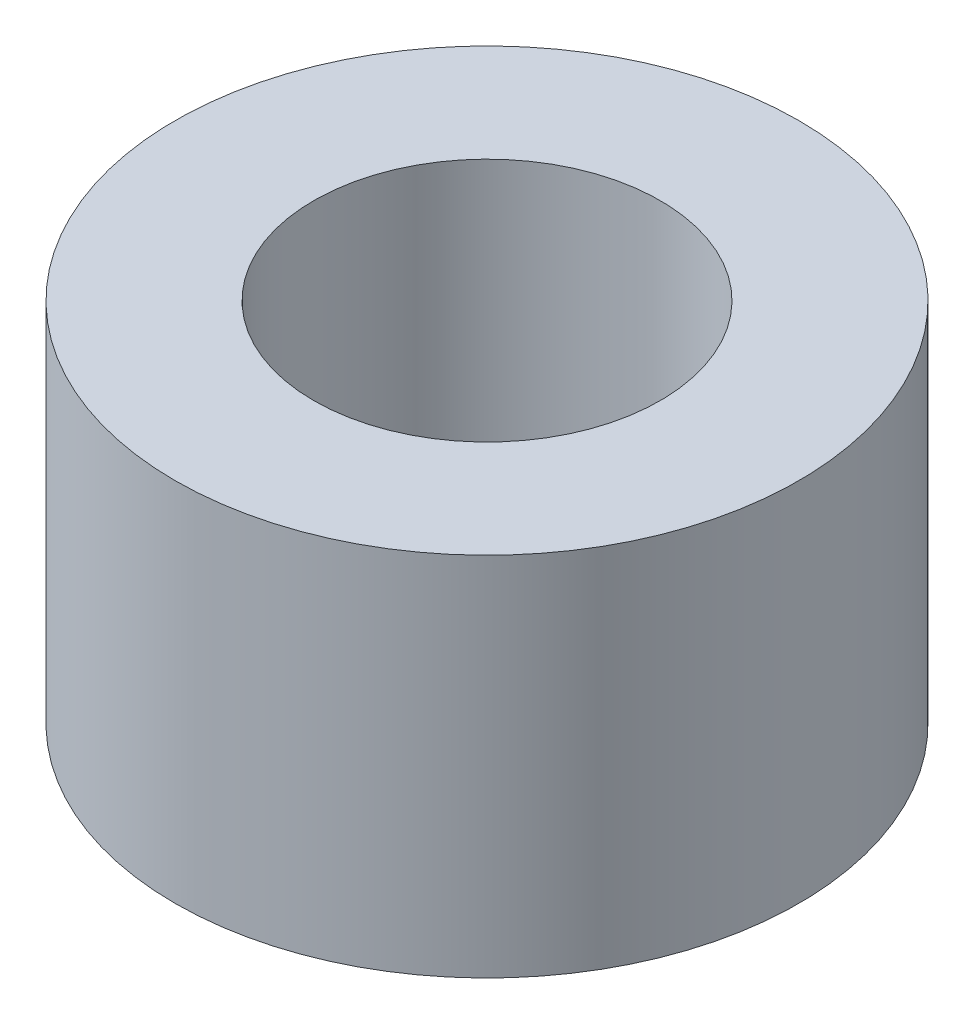
ISO-10303-21;
HEADER;
FILE_DESCRIPTION(('STEP AP214'),'2;1');
FILE_NAME('part.step','',(''),(''),'','','');
FILE_SCHEMA(('AUTOMOTIVE_DESIGN { 1 0 10303 214 1 1 1 1 }'));
ENDSEC;
DATA;
#1=APPLICATION_CONTEXT('core data for automotive mechanical design processes');
#2=APPLICATION_PROTOCOL_DEFINITION('international standard','automotive_design',2000,#1);
#3=PRODUCT_CONTEXT('',#1,'mechanical');
#4=PRODUCT('Part','Part','',(#3));
#5=PRODUCT_RELATED_PRODUCT_CATEGORY('part','',(#4));
#6=PRODUCT_DEFINITION_FORMATION('','',#4);
#7=PRODUCT_DEFINITION_CONTEXT('part definition',#1,'design');
#8=PRODUCT_DEFINITION('design','',#6,#7);
#9=PRODUCT_DEFINITION_SHAPE('','',#8);
#10=(LENGTH_UNIT() NAMED_UNIT(*) SI_UNIT(.MILLI.,.METRE.));
#11=(NAMED_UNIT(*) PLANE_ANGLE_UNIT() SI_UNIT($,.RADIAN.));
#12=(NAMED_UNIT(*) SI_UNIT($,.STERADIAN.) SOLID_ANGLE_UNIT());
#13=UNCERTAINTY_MEASURE_WITH_UNIT(LENGTH_MEASURE(1.E-05),#10,'distance_accuracy_value','');
#14=(GEOMETRIC_REPRESENTATION_CONTEXT(3) GLOBAL_UNCERTAINTY_ASSIGNED_CONTEXT((#13)) GLOBAL_UNIT_ASSIGNED_CONTEXT((#10,
#11,#12)) REPRESENTATION_CONTEXT('',''));
#15=CARTESIAN_POINT('',(0.,0.,0.));
#16=DIRECTION('',(0.,0.,1.));
#17=DIRECTION('',(1.,0.,0.));
#18=AXIS2_PLACEMENT_3D('',#15,#16,#17);
#19=CARTESIAN_POINT('',(0.,6.34,0.));
#20=DIRECTION('',(0.,1.,0.));
#21=DIRECTION('',(0.,0.,1.));
#22=AXIS2_PLACEMENT_3D('',#19,#20,#21);
#23=PLANE('',#22);
#24=CARTESIAN_POINT('',(0.,6.34,0.));
#25=DIRECTION('',(0.,1.,0.));
#26=DIRECTION('',(0.,0.,1.));
#27=AXIS2_PLACEMENT_3D('',#24,#25,#26);
#28=CIRCLE('',#27,5.4);
#29=CARTESIAN_POINT('',(0.,6.34,5.4));
#30=VERTEX_POINT('',#29);
#31=EDGE_CURVE('E10',#30,#30,#28,.T.);
#32=ORIENTED_EDGE('',*,*,#31,.T.);
#33=EDGE_LOOP('',(#32));
#34=FACE_BOUND('',#33,.T.);
#35=CARTESIAN_POINT('',(0.,6.34,0.));
#36=DIRECTION('',(0.,1.,0.));
#37=DIRECTION('',(0.,0.,1.));
#38=AXIS2_PLACEMENT_3D('',#35,#36,#37);
#39=CIRCLE('',#38,3.);
#40=CARTESIAN_POINT('',(0.,6.34,3.));
#41=VERTEX_POINT('',#40);
#42=EDGE_CURVE('E42',#41,#41,#39,.T.);
#43=ORIENTED_EDGE('',*,*,#42,.F.);
#44=EDGE_LOOP('',(#43));
#45=FACE_BOUND('',#44,.T.);
#46=ADVANCED_FACE('F31',(#34,#45),#23,.T.);
#47=CARTESIAN_POINT('',(0.,0.,0.));
#48=DIRECTION('',(0.,1.,0.));
#49=DIRECTION('',(0.,0.,1.));
#50=AXIS2_PLACEMENT_3D('',#47,#48,#49);
#51=PLANE('',#50);
#52=CARTESIAN_POINT('',(0.,0.,0.));
#53=DIRECTION('',(0.,1.,0.));
#54=DIRECTION('',(0.,0.,1.));
#55=AXIS2_PLACEMENT_3D('',#52,#53,#54);
#56=CIRCLE('',#55,5.4);
#57=CARTESIAN_POINT('',(0.,0.,5.4));
#58=VERTEX_POINT('',#57);
#59=EDGE_CURVE('E35',#58,#58,#56,.T.);
#60=ORIENTED_EDGE('',*,*,#59,.F.);
#61=EDGE_LOOP('',(#60));
#62=FACE_BOUND('',#61,.T.);
#63=CARTESIAN_POINT('',(0.,0.,0.));
#64=DIRECTION('',(0.,1.,0.));
#65=DIRECTION('',(0.,0.,1.));
#66=AXIS2_PLACEMENT_3D('',#63,#64,#65);
#67=CIRCLE('',#66,3.);
#68=CARTESIAN_POINT('',(0.,0.,3.));
#69=VERTEX_POINT('',#68);
#70=EDGE_CURVE('E44',#69,#69,#67,.T.);
#71=ORIENTED_EDGE('',*,*,#70,.T.);
#72=EDGE_LOOP('',(#71));
#73=FACE_BOUND('',#72,.T.);
#74=ADVANCED_FACE('F54',(#62,#73),#51,.F.);
#75=CARTESIAN_POINT('',(0.,6.34,0.));
#76=DIRECTION('',(0.,-1.,0.));
#77=DIRECTION('',(0.,0.,-1.));
#78=AXIS2_PLACEMENT_3D('',#75,#76,#77);
#79=CYLINDRICAL_SURFACE('',#78,5.4);
#80=ORIENTED_EDGE('',*,*,#31,.F.);
#81=EDGE_LOOP('',(#80));
#82=FACE_BOUND('',#81,.T.);
#83=ORIENTED_EDGE('',*,*,#59,.T.);
#84=EDGE_LOOP('',(#83));
#85=FACE_BOUND('',#84,.T.);
#86=ADVANCED_FACE('F33',(#82,#85),#79,.T.);
#87=CARTESIAN_POINT('',(0.,6.34,0.));
#88=DIRECTION('',(0.,-1.,0.));
#89=DIRECTION('',(0.,0.,-1.));
#90=AXIS2_PLACEMENT_3D('',#87,#88,#89);
#91=CYLINDRICAL_SURFACE('',#90,3.);
#92=ORIENTED_EDGE('',*,*,#42,.T.);
#93=EDGE_LOOP('',(#92));
#94=FACE_BOUND('',#93,.T.);
#95=ORIENTED_EDGE('',*,*,#70,.F.);
#96=EDGE_LOOP('',(#95));
#97=FACE_BOUND('',#96,.T.);
#98=ADVANCED_FACE('F50',(#94,#97),#91,.F.);
#99=CLOSED_SHELL('',(#46,#74,#86,#98));
#100=MANIFOLD_SOLID_BREP('B2',#99);
#101=ADVANCED_BREP_SHAPE_REPRESENTATION('',(#18,#100),#14);
#102=SHAPE_DEFINITION_REPRESENTATION(#9,#101);
ENDSEC;
END-ISO-10303-21;
